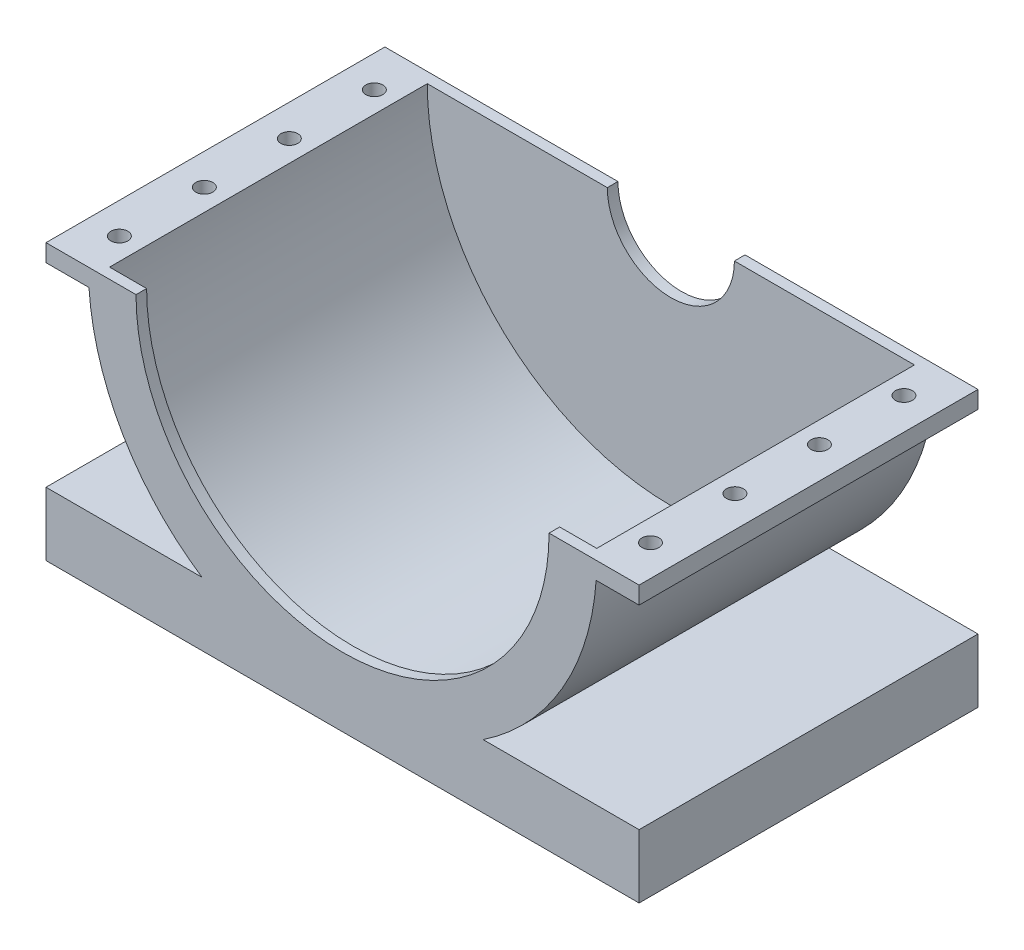
ISO-10303-21;
HEADER;
FILE_DESCRIPTION(('STEP AP214'),'2;1');
FILE_NAME('part.step','',(''),(''),'','','');
FILE_SCHEMA(('AUTOMOTIVE_DESIGN { 1 0 10303 214 1 1 1 1 }'));
ENDSEC;
DATA;
#1=APPLICATION_CONTEXT('core data for automotive mechanical design processes');
#2=APPLICATION_PROTOCOL_DEFINITION('international standard','automotive_design',2000,#1);
#3=PRODUCT_CONTEXT('',#1,'mechanical');
#4=PRODUCT('Part','Part','',(#3));
#5=PRODUCT_RELATED_PRODUCT_CATEGORY('part','',(#4));
#6=PRODUCT_DEFINITION_FORMATION('','',#4);
#7=PRODUCT_DEFINITION_CONTEXT('part definition',#1,'design');
#8=PRODUCT_DEFINITION('design','',#6,#7);
#9=PRODUCT_DEFINITION_SHAPE('','',#8);
#10=(LENGTH_UNIT() NAMED_UNIT(*) SI_UNIT(.MILLI.,.METRE.));
#11=(NAMED_UNIT(*) PLANE_ANGLE_UNIT() SI_UNIT($,.RADIAN.));
#12=(NAMED_UNIT(*) SI_UNIT($,.STERADIAN.) SOLID_ANGLE_UNIT());
#13=UNCERTAINTY_MEASURE_WITH_UNIT(LENGTH_MEASURE(1.E-05),#10,'distance_accuracy_value','');
#14=(GEOMETRIC_REPRESENTATION_CONTEXT(3) GLOBAL_UNCERTAINTY_ASSIGNED_CONTEXT((#13)) GLOBAL_UNIT_ASSIGNED_CONTEXT((#10,
#11,#12)) REPRESENTATION_CONTEXT('',''));
#15=CARTESIAN_POINT('',(0.,0.,0.));
#16=DIRECTION('',(0.,0.,1.));
#17=DIRECTION('',(1.,0.,0.));
#18=AXIS2_PLACEMENT_3D('',#15,#16,#17);
#19=CARTESIAN_POINT('',(0.,0.,-100.));
#20=DIRECTION('',(0.,0.,1.));
#21=DIRECTION('',(1.,0.,0.));
#22=AXIS2_PLACEMENT_3D('',#19,#20,#21);
#23=CYLINDRICAL_SURFACE('',#22,143.75);
#24=DIRECTION('',(0.,0.,1.));
#25=VECTOR('',#24,1.);
#26=CARTESIAN_POINT('',(143.75,0.,-100.));
#27=LINE('',#26,#25);
#28=CARTESIAN_POINT('',(143.75,0.,-93.75));
#29=VERTEX_POINT('',#28);
#30=CARTESIAN_POINT('',(143.75,0.,93.75));
#31=VERTEX_POINT('',#30);
#32=EDGE_CURVE('E55',#29,#31,#27,.T.);
#33=ORIENTED_EDGE('',*,*,#32,.F.);
#34=CARTESIAN_POINT('',(0.,0.,-93.75));
#35=DIRECTION('',(0.,0.,-1.));
#36=DIRECTION('',(-1.,0.,0.));
#37=AXIS2_PLACEMENT_3D('',#34,#35,#36);
#38=CIRCLE('',#37,143.75);
#39=CARTESIAN_POINT('',(-143.75,0.,-93.75));
#40=VERTEX_POINT('',#39);
#41=EDGE_CURVE('E50',#29,#40,#38,.T.);
#42=ORIENTED_EDGE('',*,*,#41,.T.);
#43=DIRECTION('',(0.,0.,1.));
#44=VECTOR('',#43,1.);
#45=CARTESIAN_POINT('',(-143.75,0.,-100.));
#46=LINE('',#45,#44);
#47=CARTESIAN_POINT('',(-143.75,0.,93.75));
#48=VERTEX_POINT('',#47);
#49=EDGE_CURVE('E300',#40,#48,#46,.T.);
#50=ORIENTED_EDGE('',*,*,#49,.T.);
#51=CARTESIAN_POINT('',(0.,0.,93.75));
#52=DIRECTION('',(0.,0.,1.));
#53=DIRECTION('',(1.,0.,0.));
#54=AXIS2_PLACEMENT_3D('',#51,#52,#53);
#55=CIRCLE('',#54,143.75);
#56=EDGE_CURVE('E197',#48,#31,#55,.T.);
#57=ORIENTED_EDGE('',*,*,#56,.T.);
#58=EDGE_LOOP('',(#33,#42,#50,#57));
#59=FACE_BOUND('',#58,.T.);
#60=ADVANCED_FACE('F33',(#59),#23,.F.);
#61=CARTESIAN_POINT('',(0.,0.,-100.));
#62=DIRECTION('',(0.,0.,1.));
#63=DIRECTION('',(1.,0.,0.));
#64=AXIS2_PLACEMENT_3D('',#61,#62,#63);
#65=CYLINDRICAL_SURFACE('',#64,150.);
#66=DIRECTION('',(0.,0.,1.));
#67=VECTOR('',#66,1.);
#68=CARTESIAN_POINT('',(149.649381889803,-10.2499999999999,-100.));
#69=LINE('',#68,#67);
#70=CARTESIAN_POINT('',(149.649381889803,-10.2499999999999,-100.));
#71=VERTEX_POINT('',#70);
#72=CARTESIAN_POINT('',(149.649381889803,-10.2499999999999,100.));
#73=VERTEX_POINT('',#72);
#74=EDGE_CURVE('E37',#71,#73,#69,.T.);
#75=ORIENTED_EDGE('',*,*,#74,.T.);
#76=CARTESIAN_POINT('',(0.,0.,100.));
#77=DIRECTION('',(0.,0.,1.));
#78=DIRECTION('',(1.,0.,0.));
#79=AXIS2_PLACEMENT_3D('',#76,#77,#78);
#80=CIRCLE('',#79,150.);
#81=CARTESIAN_POINT('',(82.915619758885,-125.,100.));
#82=VERTEX_POINT('',#81);
#83=EDGE_CURVE('E208',#82,#73,#80,.T.);
#84=ORIENTED_EDGE('',*,*,#83,.F.);
#85=DIRECTION('',(0.,0.,1.));
#86=VECTOR('',#85,1.);
#87=CARTESIAN_POINT('',(82.915619758885,-125.,-100.));
#88=LINE('',#87,#86);
#89=CARTESIAN_POINT('',(82.915619758885,-125.,-100.));
#90=VERTEX_POINT('',#89);
#91=EDGE_CURVE('E11',#90,#82,#88,.T.);
#92=ORIENTED_EDGE('',*,*,#91,.F.);
#93=CARTESIAN_POINT('',(0.,0.,-100.));
#94=DIRECTION('',(0.,0.,1.));
#95=DIRECTION('',(1.,0.,0.));
#96=AXIS2_PLACEMENT_3D('',#93,#94,#95);
#97=CIRCLE('',#96,150.);
#98=EDGE_CURVE('E248',#90,#71,#97,.T.);
#99=ORIENTED_EDGE('',*,*,#98,.T.);
#100=EDGE_LOOP('',(#75,#84,#92,#99));
#101=FACE_BOUND('',#100,.T.);
#102=ADVANCED_FACE('F35',(#101),#65,.T.);
#103=CARTESIAN_POINT('',(82.915619758885,-125.,-100.));
#104=DIRECTION('',(0.,1.,0.));
#105=DIRECTION('',(-1.,0.,0.));
#106=AXIS2_PLACEMENT_3D('',#103,#104,#105);
#107=PLANE('',#106);
#108=ORIENTED_EDGE('',*,*,#91,.T.);
#109=DIRECTION('',(-1.,0.,0.));
#110=VECTOR('',#109,1.);
#111=CARTESIAN_POINT('',(82.915619758885,-125.,100.));
#112=LINE('',#111,#110);
#113=CARTESIAN_POINT('',(175.,-125.,100.));
#114=VERTEX_POINT('',#113);
#115=EDGE_CURVE('E245',#114,#82,#112,.T.);
#116=ORIENTED_EDGE('',*,*,#115,.F.);
#117=DIRECTION('',(0.,0.,1.));
#118=VECTOR('',#117,1.);
#119=CARTESIAN_POINT('',(175.,-125.,-100.));
#120=LINE('',#119,#118);
#121=CARTESIAN_POINT('',(175.,-125.,-100.));
#122=VERTEX_POINT('',#121);
#123=EDGE_CURVE('E42',#122,#114,#120,.T.);
#124=ORIENTED_EDGE('',*,*,#123,.F.);
#125=DIRECTION('',(-1.,0.,0.));
#126=VECTOR('',#125,1.);
#127=CARTESIAN_POINT('',(82.915619758885,-125.,-100.));
#128=LINE('',#127,#126);
#129=EDGE_CURVE('E282',#122,#90,#128,.T.);
#130=ORIENTED_EDGE('',*,*,#129,.T.);
#131=EDGE_LOOP('',(#108,#116,#124,#130));
#132=FACE_BOUND('',#131,.T.);
#133=ADVANCED_FACE('F318',(#132),#107,.T.);
#134=CARTESIAN_POINT('',(175.,-125.,-100.));
#135=DIRECTION('',(1.,0.,0.));
#136=DIRECTION('',(0.,1.,0.));
#137=AXIS2_PLACEMENT_3D('',#134,#135,#136);
#138=PLANE('',#137);
#139=ORIENTED_EDGE('',*,*,#123,.T.);
#140=DIRECTION('',(0.,1.,0.));
#141=VECTOR('',#140,1.);
#142=CARTESIAN_POINT('',(175.,-125.,100.));
#143=LINE('',#142,#141);
#144=CARTESIAN_POINT('',(175.,-162.5,100.));
#145=VERTEX_POINT('',#144);
#146=EDGE_CURVE('E242',#145,#114,#143,.T.);
#147=ORIENTED_EDGE('',*,*,#146,.F.);
#148=DIRECTION('',(0.,0.,1.));
#149=VECTOR('',#148,1.);
#150=CARTESIAN_POINT('',(175.,-162.5,-100.));
#151=LINE('',#150,#149);
#152=CARTESIAN_POINT('',(175.,-162.5,-100.));
#153=VERTEX_POINT('',#152);
#154=EDGE_CURVE('E286',#153,#145,#151,.T.);
#155=ORIENTED_EDGE('',*,*,#154,.F.);
#156=DIRECTION('',(0.,1.,0.));
#157=VECTOR('',#156,1.);
#158=CARTESIAN_POINT('',(175.,-125.,-100.));
#159=LINE('',#158,#157);
#160=EDGE_CURVE('E279',#153,#122,#159,.T.);
#161=ORIENTED_EDGE('',*,*,#160,.T.);
#162=EDGE_LOOP('',(#139,#147,#155,#161));
#163=FACE_BOUND('',#162,.T.);
#164=ADVANCED_FACE('F358',(#163),#138,.T.);
#165=CARTESIAN_POINT('',(-175.,-162.5,-100.));
#166=DIRECTION('',(0.,-1.,0.));
#167=DIRECTION('',(1.,0.,0.));
#168=AXIS2_PLACEMENT_3D('',#165,#166,#167);
#169=PLANE('',#168);
#170=ORIENTED_EDGE('',*,*,#154,.T.);
#171=DIRECTION('',(1.,0.,0.));
#172=VECTOR('',#171,1.);
#173=CARTESIAN_POINT('',(-175.,-162.5,100.));
#174=LINE('',#173,#172);
#175=CARTESIAN_POINT('',(-175.,-162.5,100.));
#176=VERTEX_POINT('',#175);
#177=EDGE_CURVE('E239',#176,#145,#174,.T.);
#178=ORIENTED_EDGE('',*,*,#177,.F.);
#179=DIRECTION('',(0.,0.,1.));
#180=VECTOR('',#179,1.);
#181=CARTESIAN_POINT('',(-175.,-162.5,-100.));
#182=LINE('',#181,#180);
#183=CARTESIAN_POINT('',(-175.,-162.5,-100.));
#184=VERTEX_POINT('',#183);
#185=EDGE_CURVE('E288',#184,#176,#182,.T.);
#186=ORIENTED_EDGE('',*,*,#185,.F.);
#187=DIRECTION('',(1.,0.,0.));
#188=VECTOR('',#187,1.);
#189=CARTESIAN_POINT('',(-175.,-162.5,-100.));
#190=LINE('',#189,#188);
#191=EDGE_CURVE('E276',#184,#153,#190,.T.);
#192=ORIENTED_EDGE('',*,*,#191,.T.);
#193=EDGE_LOOP('',(#170,#178,#186,#192));
#194=FACE_BOUND('',#193,.T.);
#195=ADVANCED_FACE('F355',(#194),#169,.T.);
#196=CARTESIAN_POINT('',(-175.,-125.,-100.));
#197=DIRECTION('',(-1.,0.,0.));
#198=DIRECTION('',(0.,-1.,0.));
#199=AXIS2_PLACEMENT_3D('',#196,#197,#198);
#200=PLANE('',#199);
#201=ORIENTED_EDGE('',*,*,#185,.T.);
#202=DIRECTION('',(0.,-1.,0.));
#203=VECTOR('',#202,1.);
#204=CARTESIAN_POINT('',(-175.,-125.,100.));
#205=LINE('',#204,#203);
#206=CARTESIAN_POINT('',(-175.,-125.,100.));
#207=VERTEX_POINT('',#206);
#208=EDGE_CURVE('E236',#207,#176,#205,.T.);
#209=ORIENTED_EDGE('',*,*,#208,.F.);
#210=DIRECTION('',(0.,0.,1.));
#211=VECTOR('',#210,1.);
#212=CARTESIAN_POINT('',(-175.,-125.,-100.));
#213=LINE('',#212,#211);
#214=CARTESIAN_POINT('',(-175.,-125.,-100.));
#215=VERTEX_POINT('',#214);
#216=EDGE_CURVE('E290',#215,#207,#213,.T.);
#217=ORIENTED_EDGE('',*,*,#216,.F.);
#218=DIRECTION('',(0.,-1.,0.));
#219=VECTOR('',#218,1.);
#220=CARTESIAN_POINT('',(-175.,-125.,-100.));
#221=LINE('',#220,#219);
#222=EDGE_CURVE('E273',#215,#184,#221,.T.);
#223=ORIENTED_EDGE('',*,*,#222,.T.);
#224=EDGE_LOOP('',(#201,#209,#217,#223));
#225=FACE_BOUND('',#224,.T.);
#226=ADVANCED_FACE('F352',(#225),#200,.T.);
#227=CARTESIAN_POINT('',(-175.,-125.,-100.));
#228=DIRECTION('',(0.,1.,0.));
#229=DIRECTION('',(-1.,0.,0.));
#230=AXIS2_PLACEMENT_3D('',#227,#228,#229);
#231=PLANE('',#230);
#232=ORIENTED_EDGE('',*,*,#216,.T.);
#233=DIRECTION('',(-1.,0.,0.));
#234=VECTOR('',#233,1.);
#235=CARTESIAN_POINT('',(-175.,-125.,100.));
#236=LINE('',#235,#234);
#237=CARTESIAN_POINT('',(-82.915619758885,-125.,100.));
#238=VERTEX_POINT('',#237);
#239=EDGE_CURVE('E233',#238,#207,#236,.T.);
#240=ORIENTED_EDGE('',*,*,#239,.F.);
#241=DIRECTION('',(0.,0.,1.));
#242=VECTOR('',#241,1.);
#243=CARTESIAN_POINT('',(-82.915619758885,-125.,-100.));
#244=LINE('',#243,#242);
#245=CARTESIAN_POINT('',(-82.915619758885,-125.,-100.));
#246=VERTEX_POINT('',#245);
#247=EDGE_CURVE('E292',#246,#238,#244,.T.);
#248=ORIENTED_EDGE('',*,*,#247,.F.);
#249=DIRECTION('',(-1.,0.,0.));
#250=VECTOR('',#249,1.);
#251=CARTESIAN_POINT('',(-175.,-125.,-100.));
#252=LINE('',#251,#250);
#253=EDGE_CURVE('E270',#246,#215,#252,.T.);
#254=ORIENTED_EDGE('',*,*,#253,.T.);
#255=EDGE_LOOP('',(#232,#240,#248,#254));
#256=FACE_BOUND('',#255,.T.);
#257=ADVANCED_FACE('F350',(#256),#231,.T.);
#258=CARTESIAN_POINT('',(0.,0.,-100.));
#259=DIRECTION('',(0.,0.,1.));
#260=DIRECTION('',(1.,0.,0.));
#261=AXIS2_PLACEMENT_3D('',#258,#259,#260);
#262=CYLINDRICAL_SURFACE('',#261,150.);
#263=ORIENTED_EDGE('',*,*,#247,.T.);
#264=CARTESIAN_POINT('',(0.,0.,100.));
#265=DIRECTION('',(0.,0.,1.));
#266=DIRECTION('',(1.,0.,0.));
#267=AXIS2_PLACEMENT_3D('',#264,#265,#266);
#268=CIRCLE('',#267,150.);
#269=CARTESIAN_POINT('',(-149.649381889803,-10.2499999999999,100.));
#270=VERTEX_POINT('',#269);
#271=EDGE_CURVE('E230',#270,#238,#268,.T.);
#272=ORIENTED_EDGE('',*,*,#271,.F.);
#273=DIRECTION('',(0.,0.,1.));
#274=VECTOR('',#273,1.);
#275=CARTESIAN_POINT('',(-149.649381889803,-10.2499999999999,-100.));
#276=LINE('',#275,#274);
#277=CARTESIAN_POINT('',(-149.649381889803,-10.2499999999999,-100.));
#278=VERTEX_POINT('',#277);
#279=EDGE_CURVE('E294',#278,#270,#276,.T.);
#280=ORIENTED_EDGE('',*,*,#279,.F.);
#281=CARTESIAN_POINT('',(0.,0.,-100.));
#282=DIRECTION('',(0.,0.,1.));
#283=DIRECTION('',(1.,0.,0.));
#284=AXIS2_PLACEMENT_3D('',#281,#282,#283);
#285=CIRCLE('',#284,150.);
#286=EDGE_CURVE('E267',#278,#246,#285,.T.);
#287=ORIENTED_EDGE('',*,*,#286,.T.);
#288=EDGE_LOOP('',(#263,#272,#280,#287));
#289=FACE_BOUND('',#288,.T.);
#290=ADVANCED_FACE('F345',(#289),#262,.T.);
#291=CARTESIAN_POINT('',(-175.,-10.25,-100.));
#292=DIRECTION('',(0.,-1.,0.));
#293=DIRECTION('',(1.,0.,0.));
#294=AXIS2_PLACEMENT_3D('',#291,#292,#293);
#295=PLANE('',#294);
#296=CARTESIAN_POINT('',(-156.711909332652,-10.25,74.999288797542));
#297=DIRECTION('',(0.,-1.,0.));
#298=DIRECTION('',(1.,0.,0.));
#299=AXIS2_PLACEMENT_3D('',#296,#297,#298);
#300=CIRCLE('',#299,4.99999999999999);
#301=CARTESIAN_POINT('',(-151.711909332652,-10.25,74.999288797542));
#302=VERTEX_POINT('',#301);
#303=EDGE_CURVE('E423',#302,#302,#300,.F.);
#304=ORIENTED_EDGE('',*,*,#303,.T.);
#305=EDGE_LOOP('',(#304));
#306=FACE_BOUND('',#305,.T.);
#307=CARTESIAN_POINT('',(-156.557939555101,-10.25,24.999525865028));
#308=DIRECTION('',(0.,-1.,0.));
#309=DIRECTION('',(1.,0.,0.));
#310=AXIS2_PLACEMENT_3D('',#307,#308,#309);
#311=CIRCLE('',#310,4.99999999999999);
#312=CARTESIAN_POINT('',(-151.557939555101,-10.25,24.999525865028));
#313=VERTEX_POINT('',#312);
#314=EDGE_CURVE('E429',#313,#313,#311,.F.);
#315=ORIENTED_EDGE('',*,*,#314,.T.);
#316=EDGE_LOOP('',(#315));
#317=FACE_BOUND('',#316,.T.);
#318=CARTESIAN_POINT('',(-156.403969777551,-10.25,-25.000237067486));
#319=DIRECTION('',(0.,-1.,0.));
#320=DIRECTION('',(1.,0.,0.));
#321=AXIS2_PLACEMENT_3D('',#318,#319,#320);
#322=CIRCLE('',#321,4.99999999999999);
#323=CARTESIAN_POINT('',(-151.403969777551,-10.25,-25.000237067486));
#324=VERTEX_POINT('',#323);
#325=EDGE_CURVE('E439',#324,#324,#322,.F.);
#326=ORIENTED_EDGE('',*,*,#325,.T.);
#327=EDGE_LOOP('',(#326));
#328=FACE_BOUND('',#327,.T.);
#329=CARTESIAN_POINT('',(-156.25,-10.25,-75.));
#330=DIRECTION('',(0.,-1.,0.));
#331=DIRECTION('',(1.,0.,0.));
#332=AXIS2_PLACEMENT_3D('',#329,#330,#331);
#333=CIRCLE('',#332,4.99999999999999);
#334=CARTESIAN_POINT('',(-151.25,-10.25,-75.));
#335=VERTEX_POINT('',#334);
#336=EDGE_CURVE('E410',#335,#335,#333,.F.);
#337=ORIENTED_EDGE('',*,*,#336,.T.);
#338=EDGE_LOOP('',(#337));
#339=FACE_BOUND('',#338,.T.);
#340=ORIENTED_EDGE('',*,*,#279,.T.);
#341=DIRECTION('',(1.,0.,0.));
#342=VECTOR('',#341,1.);
#343=CARTESIAN_POINT('',(-175.,-10.25,100.));
#344=LINE('',#343,#342);
#345=CARTESIAN_POINT('',(-175.,-10.25,100.));
#346=VERTEX_POINT('',#345);
#347=EDGE_CURVE('E227',#346,#270,#344,.T.);
#348=ORIENTED_EDGE('',*,*,#347,.F.);
#349=DIRECTION('',(0.,0.,1.));
#350=VECTOR('',#349,1.);
#351=CARTESIAN_POINT('',(-175.,-10.25,-100.));
#352=LINE('',#351,#350);
#353=CARTESIAN_POINT('',(-175.,-10.25,-100.));
#354=VERTEX_POINT('',#353);
#355=EDGE_CURVE('E296',#354,#346,#352,.T.);
#356=ORIENTED_EDGE('',*,*,#355,.F.);
#357=DIRECTION('',(1.,0.,0.));
#358=VECTOR('',#357,1.);
#359=CARTESIAN_POINT('',(-175.,-10.25,-100.));
#360=LINE('',#359,#358);
#361=EDGE_CURVE('E264',#354,#278,#360,.T.);
#362=ORIENTED_EDGE('',*,*,#361,.T.);
#363=EDGE_LOOP('',(#340,#348,#356,#362));
#364=FACE_BOUND('',#363,.T.);
#365=ADVANCED_FACE('F340',(#306,#317,#328,#339,#364),#295,.T.);
#366=CARTESIAN_POINT('',(-175.,0.,-100.));
#367=DIRECTION('',(-1.,0.,0.));
#368=DIRECTION('',(0.,0.,1.));
#369=AXIS2_PLACEMENT_3D('',#366,#367,#368);
#370=PLANE('',#369);
#371=ORIENTED_EDGE('',*,*,#355,.T.);
#372=DIRECTION('',(0.,-1.,0.));
#373=VECTOR('',#372,1.);
#374=CARTESIAN_POINT('',(-175.,0.,100.));
#375=LINE('',#374,#373);
#376=CARTESIAN_POINT('',(-175.,0.,100.));
#377=VERTEX_POINT('',#376);
#378=EDGE_CURVE('E224',#377,#346,#375,.T.);
#379=ORIENTED_EDGE('',*,*,#378,.F.);
#380=DIRECTION('',(0.,0.,1.));
#381=VECTOR('',#380,1.);
#382=CARTESIAN_POINT('',(-175.,0.,-100.));
#383=LINE('',#382,#381);
#384=CARTESIAN_POINT('',(-175.,0.,-100.));
#385=VERTEX_POINT('',#384);
#386=EDGE_CURVE('E298',#385,#377,#383,.T.);
#387=ORIENTED_EDGE('',*,*,#386,.F.);
#388=DIRECTION('',(0.,-1.,0.));
#389=VECTOR('',#388,1.);
#390=CARTESIAN_POINT('',(-175.,0.,-100.));
#391=LINE('',#390,#389);
#392=EDGE_CURVE('E261',#385,#354,#391,.T.);
#393=ORIENTED_EDGE('',*,*,#392,.T.);
#394=EDGE_LOOP('',(#371,#379,#387,#393));
#395=FACE_BOUND('',#394,.T.);
#396=ADVANCED_FACE('F336',(#395),#370,.T.);
#397=CARTESIAN_POINT('',(-175.,0.,-100.));
#398=DIRECTION('',(0.,1.,0.));
#399=DIRECTION('',(-1.,0.,0.));
#400=AXIS2_PLACEMENT_3D('',#397,#398,#399);
#401=PLANE('',#400);
#402=CARTESIAN_POINT('',(-156.711909332652,0.,74.999288797542));
#403=DIRECTION('',(0.,1.,0.));
#404=DIRECTION('',(1.,0.,0.));
#405=AXIS2_PLACEMENT_3D('',#402,#403,#404);
#406=CIRCLE('',#405,4.99999999999999);
#407=CARTESIAN_POINT('',(-151.711909332652,0.,74.999288797542));
#408=VERTEX_POINT('',#407);
#409=EDGE_CURVE('E420',#408,#408,#406,.T.);
#410=ORIENTED_EDGE('',*,*,#409,.F.);
#411=EDGE_LOOP('',(#410));
#412=FACE_BOUND('',#411,.T.);
#413=CARTESIAN_POINT('',(-156.557939555101,0.,24.999525865028));
#414=DIRECTION('',(0.,1.,0.));
#415=DIRECTION('',(1.,0.,0.));
#416=AXIS2_PLACEMENT_3D('',#413,#414,#415);
#417=CIRCLE('',#416,4.99999999999999);
#418=CARTESIAN_POINT('',(-151.557939555101,0.,24.999525865028));
#419=VERTEX_POINT('',#418);
#420=EDGE_CURVE('E425',#419,#419,#417,.T.);
#421=ORIENTED_EDGE('',*,*,#420,.F.);
#422=EDGE_LOOP('',(#421));
#423=FACE_BOUND('',#422,.T.);
#424=CARTESIAN_POINT('',(-156.403969777551,0.,-25.000237067486));
#425=DIRECTION('',(0.,1.,0.));
#426=DIRECTION('',(1.,0.,0.));
#427=AXIS2_PLACEMENT_3D('',#424,#425,#426);
#428=CIRCLE('',#427,4.99999999999999);
#429=CARTESIAN_POINT('',(-151.403969777551,0.,-25.000237067486));
#430=VERTEX_POINT('',#429);
#431=EDGE_CURVE('E434',#430,#430,#428,.T.);
#432=ORIENTED_EDGE('',*,*,#431,.F.);
#433=EDGE_LOOP('',(#432));
#434=FACE_BOUND('',#433,.T.);
#435=CARTESIAN_POINT('',(-156.25,0.,-75.));
#436=DIRECTION('',(0.,1.,0.));
#437=DIRECTION('',(1.,0.,0.));
#438=AXIS2_PLACEMENT_3D('',#435,#436,#437);
#439=CIRCLE('',#438,4.99999999999999);
#440=CARTESIAN_POINT('',(-151.25,0.,-75.));
#441=VERTEX_POINT('',#440);
#442=EDGE_CURVE('E441',#441,#441,#439,.T.);
#443=ORIENTED_EDGE('',*,*,#442,.F.);
#444=EDGE_LOOP('',(#443));
#445=FACE_BOUND('',#444,.T.);
#446=ORIENTED_EDGE('',*,*,#386,.T.);
#447=DIRECTION('',(-1.,0.,0.));
#448=VECTOR('',#447,1.);
#449=CARTESIAN_POINT('',(-175.,0.,100.));
#450=LINE('',#449,#448);
#451=CARTESIAN_POINT('',(-121.875,0.,100.));
#452=VERTEX_POINT('',#451);
#453=EDGE_CURVE('E221',#452,#377,#450,.T.);
#454=ORIENTED_EDGE('',*,*,#453,.F.);
#455=DIRECTION('',(0.,0.,1.));
#456=VECTOR('',#455,1.);
#457=CARTESIAN_POINT('',(-121.875,0.,93.75));
#458=LINE('',#457,#456);
#459=CARTESIAN_POINT('',(-121.875,0.,93.75));
#460=VERTEX_POINT('',#459);
#461=EDGE_CURVE('E202',#460,#452,#458,.T.);
#462=ORIENTED_EDGE('',*,*,#461,.F.);
#463=DIRECTION('',(-1.,0.,0.));
#464=VECTOR('',#463,1.);
#465=CARTESIAN_POINT('',(-143.75,0.,93.75));
#466=LINE('',#465,#464);
#467=EDGE_CURVE('E194',#460,#48,#466,.T.);
#468=ORIENTED_EDGE('',*,*,#467,.T.);
#469=ORIENTED_EDGE('',*,*,#49,.F.);
#470=DIRECTION('',(1.,0.,0.));
#471=VECTOR('',#470,1.);
#472=CARTESIAN_POINT('',(-37.5,0.,-93.75));
#473=LINE('',#472,#471);
#474=CARTESIAN_POINT('',(-37.5,0.,-93.75));
#475=VERTEX_POINT('',#474);
#476=EDGE_CURVE('E168',#40,#475,#473,.T.);
#477=ORIENTED_EDGE('',*,*,#476,.T.);
#478=DIRECTION('',(0.,0.,-1.));
#479=VECTOR('',#478,1.);
#480=CARTESIAN_POINT('',(-37.5,0.,-93.75));
#481=LINE('',#480,#479);
#482=CARTESIAN_POINT('',(-37.5,0.,-100.));
#483=VERTEX_POINT('',#482);
#484=EDGE_CURVE('E167',#475,#483,#481,.T.);
#485=ORIENTED_EDGE('',*,*,#484,.T.);
#486=DIRECTION('',(-1.,0.,0.));
#487=VECTOR('',#486,1.);
#488=CARTESIAN_POINT('',(-175.,0.,-100.));
#489=LINE('',#488,#487);
#490=EDGE_CURVE('E258',#483,#385,#489,.T.);
#491=ORIENTED_EDGE('',*,*,#490,.T.);
#492=EDGE_LOOP('',(#446,#454,#462,#468,#469,#477,#485,#491));
#493=FACE_BOUND('',#492,.T.);
#494=ADVANCED_FACE('F374',(#412,#423,#434,#445,#493),#401,.T.);
#495=CARTESIAN_POINT('',(143.75,0.,-100.));
#496=DIRECTION('',(0.,1.,0.));
#497=DIRECTION('',(-1.,0.,0.));
#498=AXIS2_PLACEMENT_3D('',#495,#496,#497);
#499=PLANE('',#498);
#500=CARTESIAN_POINT('',(156.403969777551,0.,-25.000237067486));
#501=DIRECTION('',(0.,1.,0.));
#502=DIRECTION('',(-1.,0.,0.));
#503=AXIS2_PLACEMENT_3D('',#500,#501,#502);
#504=CIRCLE('',#503,4.99999999999999);
#505=CARTESIAN_POINT('',(151.403969777551,0.,-25.000237067486));
#506=VERTEX_POINT('',#505);
#507=EDGE_CURVE('E401',#506,#506,#504,.T.);
#508=ORIENTED_EDGE('',*,*,#507,.F.);
#509=EDGE_LOOP('',(#508));
#510=FACE_BOUND('',#509,.T.);
#511=CARTESIAN_POINT('',(156.557939555101,0.,24.999525865028));
#512=DIRECTION('',(0.,1.,0.));
#513=DIRECTION('',(-1.,0.,0.));
#514=AXIS2_PLACEMENT_3D('',#511,#512,#513);
#515=CIRCLE('',#514,4.99999999999999);
#516=CARTESIAN_POINT('',(151.557939555101,0.,24.999525865028));
#517=VERTEX_POINT('',#516);
#518=EDGE_CURVE('E407',#517,#517,#515,.T.);
#519=ORIENTED_EDGE('',*,*,#518,.F.);
#520=EDGE_LOOP('',(#519));
#521=FACE_BOUND('',#520,.T.);
#522=CARTESIAN_POINT('',(156.711909332652,0.,74.999288797542));
#523=DIRECTION('',(0.,1.,0.));
#524=DIRECTION('',(-1.,0.,0.));
#525=AXIS2_PLACEMENT_3D('',#522,#523,#524);
#526=CIRCLE('',#525,4.99999999999999);
#527=CARTESIAN_POINT('',(151.711909332652,0.,74.999288797542));
#528=VERTEX_POINT('',#527);
#529=EDGE_CURVE('E416',#528,#528,#526,.T.);
#530=ORIENTED_EDGE('',*,*,#529,.F.);
#531=EDGE_LOOP('',(#530));
#532=FACE_BOUND('',#531,.T.);
#533=CARTESIAN_POINT('',(156.25,0.,-75.));
#534=DIRECTION('',(0.,1.,0.));
#535=DIRECTION('',(-1.,0.,0.));
#536=AXIS2_PLACEMENT_3D('',#533,#534,#535);
#537=CIRCLE('',#536,4.99999999999999);
#538=CARTESIAN_POINT('',(151.25,0.,-75.));
#539=VERTEX_POINT('',#538);
#540=EDGE_CURVE('E181',#539,#539,#537,.T.);
#541=ORIENTED_EDGE('',*,*,#540,.F.);
#542=EDGE_LOOP('',(#541));
#543=FACE_BOUND('',#542,.T.);
#544=DIRECTION('',(-1.,0.,0.));
#545=VECTOR('',#544,1.);
#546=CARTESIAN_POINT('',(143.75,0.,-100.));
#547=LINE('',#546,#545);
#548=CARTESIAN_POINT('',(175.,0.,-100.));
#549=VERTEX_POINT('',#548);
#550=CARTESIAN_POINT('',(37.5,0.,-100.));
#551=VERTEX_POINT('',#550);
#552=EDGE_CURVE('E162',#549,#551,#547,.T.);
#553=ORIENTED_EDGE('',*,*,#552,.T.);
#554=DIRECTION('',(0.,0.,-1.));
#555=VECTOR('',#554,1.);
#556=CARTESIAN_POINT('',(37.5,0.,-93.75));
#557=LINE('',#556,#555);
#558=CARTESIAN_POINT('',(37.5,0.,-93.75));
#559=VERTEX_POINT('',#558);
#560=EDGE_CURVE('E157',#559,#551,#557,.T.);
#561=ORIENTED_EDGE('',*,*,#560,.F.);
#562=DIRECTION('',(1.,0.,0.));
#563=VECTOR('',#562,1.);
#564=CARTESIAN_POINT('',(143.75,0.,-93.75));
#565=LINE('',#564,#563);
#566=EDGE_CURVE('E160',#559,#29,#565,.T.);
#567=ORIENTED_EDGE('',*,*,#566,.T.);
#568=ORIENTED_EDGE('',*,*,#32,.T.);
#569=DIRECTION('',(-1.,0.,0.));
#570=VECTOR('',#569,1.);
#571=CARTESIAN_POINT('',(121.875,0.,93.75));
#572=LINE('',#571,#570);
#573=CARTESIAN_POINT('',(121.875,0.,93.75));
#574=VERTEX_POINT('',#573);
#575=EDGE_CURVE('E199',#31,#574,#572,.T.);
#576=ORIENTED_EDGE('',*,*,#575,.T.);
#577=DIRECTION('',(0.,0.,1.));
#578=VECTOR('',#577,1.);
#579=CARTESIAN_POINT('',(121.875,0.,93.75));
#580=LINE('',#579,#578);
#581=CARTESIAN_POINT('',(121.875,0.,100.));
#582=VERTEX_POINT('',#581);
#583=EDGE_CURVE('E205',#574,#582,#580,.T.);
#584=ORIENTED_EDGE('',*,*,#583,.T.);
#585=DIRECTION('',(-1.,0.,0.));
#586=VECTOR('',#585,1.);
#587=CARTESIAN_POINT('',(143.75,0.,100.));
#588=LINE('',#587,#586);
#589=CARTESIAN_POINT('',(175.,0.,100.));
#590=VERTEX_POINT('',#589);
#591=EDGE_CURVE('E219',#590,#582,#588,.T.);
#592=ORIENTED_EDGE('',*,*,#591,.F.);
#593=DIRECTION('',(0.,0.,1.));
#594=VECTOR('',#593,1.);
#595=CARTESIAN_POINT('',(175.,0.,-100.));
#596=LINE('',#595,#594);
#597=EDGE_CURVE('E303',#549,#590,#596,.T.);
#598=ORIENTED_EDGE('',*,*,#597,.F.);
#599=EDGE_LOOP('',(#553,#561,#567,#568,#576,#584,#592,#598));
#600=FACE_BOUND('',#599,.T.);
#601=ADVANCED_FACE('F159',(#510,#521,#532,#543,#600),#499,.T.);
#602=CARTESIAN_POINT('',(175.,-10.2499999999999,-100.));
#603=DIRECTION('',(1.,0.,0.));
#604=DIRECTION('',(0.,0.,-1.));
#605=AXIS2_PLACEMENT_3D('',#602,#603,#604);
#606=PLANE('',#605);
#607=ORIENTED_EDGE('',*,*,#597,.T.);
#608=DIRECTION('',(0.,1.,0.));
#609=VECTOR('',#608,1.);
#610=CARTESIAN_POINT('',(175.,-10.2499999999999,100.));
#611=LINE('',#610,#609);
#612=CARTESIAN_POINT('',(175.,-10.2499999999999,100.));
#613=VERTEX_POINT('',#612);
#614=EDGE_CURVE('E216',#613,#590,#611,.T.);
#615=ORIENTED_EDGE('',*,*,#614,.F.);
#616=DIRECTION('',(0.,0.,1.));
#617=VECTOR('',#616,1.);
#618=CARTESIAN_POINT('',(175.,-10.2499999999999,-100.));
#619=LINE('',#618,#617);
#620=CARTESIAN_POINT('',(175.,-10.2499999999999,-100.));
#621=VERTEX_POINT('',#620);
#622=EDGE_CURVE('E304',#621,#613,#619,.T.);
#623=ORIENTED_EDGE('',*,*,#622,.F.);
#624=DIRECTION('',(0.,1.,0.));
#625=VECTOR('',#624,1.);
#626=CARTESIAN_POINT('',(175.,-10.2499999999999,-100.));
#627=LINE('',#626,#625);
#628=EDGE_CURVE('E254',#621,#549,#627,.T.);
#629=ORIENTED_EDGE('',*,*,#628,.T.);
#630=EDGE_LOOP('',(#607,#615,#623,#629));
#631=FACE_BOUND('',#630,.T.);
#632=ADVANCED_FACE('F325',(#631),#606,.T.);
#633=CARTESIAN_POINT('',(149.649381889803,-10.2499999999999,-100.));
#634=DIRECTION('',(0.,-1.,0.));
#635=DIRECTION('',(0.,0.,-1.));
#636=AXIS2_PLACEMENT_3D('',#633,#634,#635);
#637=PLANE('',#636);
#638=CARTESIAN_POINT('',(156.403969777551,-10.2499999999999,-25.000237067486));
#639=DIRECTION('',(0.,-1.,0.));
#640=DIRECTION('',(0.,0.,-1.));
#641=AXIS2_PLACEMENT_3D('',#638,#639,#640);
#642=CIRCLE('',#641,4.99999999999999);
#643=CARTESIAN_POINT('',(156.403969777551,-10.2499999999999,-30.000237067486));
#644=VERTEX_POINT('',#643);
#645=EDGE_CURVE('E389',#644,#644,#642,.F.);
#646=ORIENTED_EDGE('',*,*,#645,.T.);
#647=EDGE_LOOP('',(#646));
#648=FACE_BOUND('',#647,.T.);
#649=CARTESIAN_POINT('',(156.557939555101,-10.2499999999999,24.999525865028));
#650=DIRECTION('',(0.,-1.,0.));
#651=DIRECTION('',(0.,0.,-1.));
#652=AXIS2_PLACEMENT_3D('',#649,#650,#651);
#653=CIRCLE('',#652,4.99999999999999);
#654=CARTESIAN_POINT('',(156.557939555101,-10.2499999999999,19.999525865028));
#655=VERTEX_POINT('',#654);
#656=EDGE_CURVE('E393',#655,#655,#653,.F.);
#657=ORIENTED_EDGE('',*,*,#656,.T.);
#658=EDGE_LOOP('',(#657));
#659=FACE_BOUND('',#658,.T.);
#660=CARTESIAN_POINT('',(156.711909332652,-10.2499999999999,74.999288797542));
#661=DIRECTION('',(0.,-1.,0.));
#662=DIRECTION('',(0.,0.,-1.));
#663=AXIS2_PLACEMENT_3D('',#660,#661,#662);
#664=CIRCLE('',#663,4.99999999999999);
#665=CARTESIAN_POINT('',(156.711909332652,-10.2499999999999,69.999288797542));
#666=VERTEX_POINT('',#665);
#667=EDGE_CURVE('E397',#666,#666,#664,.F.);
#668=ORIENTED_EDGE('',*,*,#667,.T.);
#669=EDGE_LOOP('',(#668));
#670=FACE_BOUND('',#669,.T.);
#671=CARTESIAN_POINT('',(156.25,-10.2499999999999,-75.));
#672=DIRECTION('',(0.,-1.,0.));
#673=DIRECTION('',(0.,0.,-1.));
#674=AXIS2_PLACEMENT_3D('',#671,#672,#673);
#675=CIRCLE('',#674,4.99999999999999);
#676=CARTESIAN_POINT('',(156.25,-10.2499999999999,-80.));
#677=VERTEX_POINT('',#676);
#678=EDGE_CURVE('E184',#677,#677,#675,.F.);
#679=ORIENTED_EDGE('',*,*,#678,.T.);
#680=EDGE_LOOP('',(#679));
#681=FACE_BOUND('',#680,.T.);
#682=ORIENTED_EDGE('',*,*,#622,.T.);
#683=DIRECTION('',(1.,0.,0.));
#684=VECTOR('',#683,1.);
#685=CARTESIAN_POINT('',(149.649381889803,-10.2499999999999,100.));
#686=LINE('',#685,#684);
#687=EDGE_CURVE('E213',#73,#613,#686,.T.);
#688=ORIENTED_EDGE('',*,*,#687,.F.);
#689=ORIENTED_EDGE('',*,*,#74,.F.);
#690=DIRECTION('',(1.,0.,0.));
#691=VECTOR('',#690,1.);
#692=CARTESIAN_POINT('',(149.649381889803,-10.2499999999999,-100.));
#693=LINE('',#692,#691);
#694=EDGE_CURVE('E251',#71,#621,#693,.T.);
#695=ORIENTED_EDGE('',*,*,#694,.T.);
#696=EDGE_LOOP('',(#682,#688,#689,#695));
#697=FACE_BOUND('',#696,.T.);
#698=ADVANCED_FACE('F311',(#648,#659,#670,#681,#697),#637,.T.);
#699=CARTESIAN_POINT('',(0.,0.,-100.));
#700=DIRECTION('',(0.,0.,1.));
#701=DIRECTION('',(1.,0.,0.));
#702=AXIS2_PLACEMENT_3D('',#699,#700,#701);
#703=PLANE('',#702);
#704=ORIENTED_EDGE('',*,*,#98,.F.);
#705=ORIENTED_EDGE('',*,*,#129,.F.);
#706=ORIENTED_EDGE('',*,*,#160,.F.);
#707=ORIENTED_EDGE('',*,*,#191,.F.);
#708=ORIENTED_EDGE('',*,*,#222,.F.);
#709=ORIENTED_EDGE('',*,*,#253,.F.);
#710=ORIENTED_EDGE('',*,*,#286,.F.);
#711=ORIENTED_EDGE('',*,*,#361,.F.);
#712=ORIENTED_EDGE('',*,*,#392,.F.);
#713=ORIENTED_EDGE('',*,*,#490,.F.);
#714=CARTESIAN_POINT('',(0.,0.,-100.));
#715=DIRECTION('',(0.,0.,1.));
#716=DIRECTION('',(-1.,0.,0.));
#717=AXIS2_PLACEMENT_3D('',#714,#715,#716);
#718=CIRCLE('',#717,37.5);
#719=EDGE_CURVE('E179',#483,#551,#718,.T.);
#720=ORIENTED_EDGE('',*,*,#719,.T.);
#721=ORIENTED_EDGE('',*,*,#552,.F.);
#722=ORIENTED_EDGE('',*,*,#628,.F.);
#723=ORIENTED_EDGE('',*,*,#694,.F.);
#724=EDGE_LOOP('',(#704,#705,#706,#707,#708,#709,#710,#711,#712,#713,#720,#721,#722,#723));
#725=FACE_BOUND('',#724,.T.);
#726=ADVANCED_FACE('F321',(#725),#703,.F.);
#727=CARTESIAN_POINT('',(0.,0.,100.));
#728=DIRECTION('',(0.,0.,1.));
#729=DIRECTION('',(1.,0.,0.));
#730=AXIS2_PLACEMENT_3D('',#727,#728,#729);
#731=PLANE('',#730);
#732=ORIENTED_EDGE('',*,*,#83,.T.);
#733=ORIENTED_EDGE('',*,*,#687,.T.);
#734=ORIENTED_EDGE('',*,*,#614,.T.);
#735=ORIENTED_EDGE('',*,*,#591,.T.);
#736=CARTESIAN_POINT('',(0.,0.,100.));
#737=DIRECTION('',(0.,0.,-1.));
#738=DIRECTION('',(1.,0.,0.));
#739=AXIS2_PLACEMENT_3D('',#736,#737,#738);
#740=CIRCLE('',#739,121.875);
#741=EDGE_CURVE('E189',#582,#452,#740,.T.);
#742=ORIENTED_EDGE('',*,*,#741,.T.);
#743=ORIENTED_EDGE('',*,*,#453,.T.);
#744=ORIENTED_EDGE('',*,*,#378,.T.);
#745=ORIENTED_EDGE('',*,*,#347,.T.);
#746=ORIENTED_EDGE('',*,*,#271,.T.);
#747=ORIENTED_EDGE('',*,*,#239,.T.);
#748=ORIENTED_EDGE('',*,*,#208,.T.);
#749=ORIENTED_EDGE('',*,*,#177,.T.);
#750=ORIENTED_EDGE('',*,*,#146,.T.);
#751=ORIENTED_EDGE('',*,*,#115,.T.);
#752=EDGE_LOOP('',(#732,#733,#734,#735,#742,#743,#744,#745,#746,#747,#748,#749,#750,#751));
#753=FACE_BOUND('',#752,.T.);
#754=ADVANCED_FACE('F314',(#753),#731,.T.);
#755=CARTESIAN_POINT('',(0.,0.,93.75));
#756=DIRECTION('',(0.,0.,1.));
#757=DIRECTION('',(1.,0.,0.));
#758=AXIS2_PLACEMENT_3D('',#755,#756,#757);
#759=CYLINDRICAL_SURFACE('',#758,121.875);
#760=ORIENTED_EDGE('',*,*,#741,.F.);
#761=ORIENTED_EDGE('',*,*,#583,.F.);
#762=CARTESIAN_POINT('',(0.,0.,93.75));
#763=DIRECTION('',(0.,0.,-1.));
#764=DIRECTION('',(1.,0.,0.));
#765=AXIS2_PLACEMENT_3D('',#762,#763,#764);
#766=CIRCLE('',#765,121.875);
#767=EDGE_CURVE('E191',#574,#460,#766,.T.);
#768=ORIENTED_EDGE('',*,*,#767,.T.);
#769=ORIENTED_EDGE('',*,*,#461,.T.);
#770=EDGE_LOOP('',(#760,#761,#768,#769));
#771=FACE_BOUND('',#770,.T.);
#772=ADVANCED_FACE('F331',(#771),#759,.F.);
#773=CARTESIAN_POINT('',(0.,0.,93.75));
#774=DIRECTION('',(0.,0.,1.));
#775=DIRECTION('',(1.,0.,0.));
#776=AXIS2_PLACEMENT_3D('',#773,#774,#775);
#777=PLANE('',#776);
#778=ORIENTED_EDGE('',*,*,#767,.F.);
#779=ORIENTED_EDGE('',*,*,#575,.F.);
#780=ORIENTED_EDGE('',*,*,#56,.F.);
#781=ORIENTED_EDGE('',*,*,#467,.F.);
#782=EDGE_LOOP('',(#778,#779,#780,#781));
#783=FACE_BOUND('',#782,.T.);
#784=ADVANCED_FACE('F484',(#783),#777,.F.);
#785=CARTESIAN_POINT('',(0.,0.,-93.75));
#786=DIRECTION('',(0.,0.,-1.));
#787=DIRECTION('',(-1.,0.,0.));
#788=AXIS2_PLACEMENT_3D('',#785,#786,#787);
#789=CYLINDRICAL_SURFACE('',#788,37.5);
#790=ORIENTED_EDGE('',*,*,#719,.F.);
#791=ORIENTED_EDGE('',*,*,#484,.F.);
#792=CARTESIAN_POINT('',(0.,0.,-93.75));
#793=DIRECTION('',(0.,0.,1.));
#794=DIRECTION('',(-1.,0.,0.));
#795=AXIS2_PLACEMENT_3D('',#792,#793,#794);
#796=CIRCLE('',#795,37.5);
#797=EDGE_CURVE('E174',#475,#559,#796,.T.);
#798=ORIENTED_EDGE('',*,*,#797,.T.);
#799=ORIENTED_EDGE('',*,*,#560,.T.);
#800=EDGE_LOOP('',(#790,#791,#798,#799));
#801=FACE_BOUND('',#800,.T.);
#802=ADVANCED_FACE('F177',(#801),#789,.F.);
#803=CARTESIAN_POINT('',(0.,0.,-93.75));
#804=DIRECTION('',(0.,0.,-1.));
#805=DIRECTION('',(-1.,0.,0.));
#806=AXIS2_PLACEMENT_3D('',#803,#804,#805);
#807=PLANE('',#806);
#808=ORIENTED_EDGE('',*,*,#797,.F.);
#809=ORIENTED_EDGE('',*,*,#476,.F.);
#810=ORIENTED_EDGE('',*,*,#41,.F.);
#811=ORIENTED_EDGE('',*,*,#566,.F.);
#812=EDGE_LOOP('',(#808,#809,#810,#811));
#813=FACE_BOUND('',#812,.T.);
#814=ADVANCED_FACE('F172',(#813),#807,.F.);
#815=CARTESIAN_POINT('',(156.25,-162.501,-75.));
#816=DIRECTION('',(0.,1.,0.));
#817=DIRECTION('',(-1.,0.,0.));
#818=AXIS2_PLACEMENT_3D('',#815,#816,#817);
#819=CYLINDRICAL_SURFACE('',#818,4.99999999999999);
#820=ORIENTED_EDGE('',*,*,#678,.F.);
#821=EDGE_LOOP('',(#820));
#822=FACE_BOUND('',#821,.T.);
#823=ORIENTED_EDGE('',*,*,#540,.T.);
#824=EDGE_LOOP('',(#823));
#825=FACE_BOUND('',#824,.T.);
#826=ADVANCED_FACE('F472',(#822,#825),#819,.F.);
#827=CARTESIAN_POINT('',(156.711909332652,-162.501,74.999288797542));
#828=DIRECTION('',(0.,1.,0.));
#829=DIRECTION('',(-1.,0.,0.));
#830=AXIS2_PLACEMENT_3D('',#827,#828,#829);
#831=CYLINDRICAL_SURFACE('',#830,4.99999999999999);
#832=ORIENTED_EDGE('',*,*,#667,.F.);
#833=EDGE_LOOP('',(#832));
#834=FACE_BOUND('',#833,.T.);
#835=ORIENTED_EDGE('',*,*,#529,.T.);
#836=EDGE_LOOP('',(#835));
#837=FACE_BOUND('',#836,.T.);
#838=ADVANCED_FACE('F468',(#834,#837),#831,.F.);
#839=CARTESIAN_POINT('',(156.557939555101,-162.501,24.999525865028));
#840=DIRECTION('',(0.,1.,0.));
#841=DIRECTION('',(-1.,0.,0.));
#842=AXIS2_PLACEMENT_3D('',#839,#840,#841);
#843=CYLINDRICAL_SURFACE('',#842,4.99999999999999);
#844=ORIENTED_EDGE('',*,*,#656,.F.);
#845=EDGE_LOOP('',(#844));
#846=FACE_BOUND('',#845,.T.);
#847=ORIENTED_EDGE('',*,*,#518,.T.);
#848=EDGE_LOOP('',(#847));
#849=FACE_BOUND('',#848,.T.);
#850=ADVANCED_FACE('F461',(#846,#849),#843,.F.);
#851=CARTESIAN_POINT('',(156.403969777551,-162.501,-25.000237067486));
#852=DIRECTION('',(0.,1.,0.));
#853=DIRECTION('',(-1.,0.,0.));
#854=AXIS2_PLACEMENT_3D('',#851,#852,#853);
#855=CYLINDRICAL_SURFACE('',#854,4.99999999999999);
#856=ORIENTED_EDGE('',*,*,#645,.F.);
#857=EDGE_LOOP('',(#856));
#858=FACE_BOUND('',#857,.T.);
#859=ORIENTED_EDGE('',*,*,#507,.T.);
#860=EDGE_LOOP('',(#859));
#861=FACE_BOUND('',#860,.T.);
#862=ADVANCED_FACE('F452',(#858,#861),#855,.F.);
#863=CARTESIAN_POINT('',(-156.25,-162.501,-75.));
#864=DIRECTION('',(0.,1.,0.));
#865=DIRECTION('',(-1.,0.,0.));
#866=AXIS2_PLACEMENT_3D('',#863,#864,#865);
#867=CYLINDRICAL_SURFACE('',#866,4.99999999999999);
#868=ORIENTED_EDGE('',*,*,#336,.F.);
#869=EDGE_LOOP('',(#868));
#870=FACE_BOUND('',#869,.T.);
#871=ORIENTED_EDGE('',*,*,#442,.T.);
#872=EDGE_LOOP('',(#871));
#873=FACE_BOUND('',#872,.T.);
#874=ADVANCED_FACE('F449',(#870,#873),#867,.F.);
#875=CARTESIAN_POINT('',(-156.40396977755,-162.501,-25.000237067486));
#876=DIRECTION('',(0.,1.,0.));
#877=DIRECTION('',(-1.,0.,0.));
#878=AXIS2_PLACEMENT_3D('',#875,#876,#877);
#879=CYLINDRICAL_SURFACE('',#878,4.99999999999999);
#880=ORIENTED_EDGE('',*,*,#325,.F.);
#881=EDGE_LOOP('',(#880));
#882=FACE_BOUND('',#881,.T.);
#883=ORIENTED_EDGE('',*,*,#431,.T.);
#884=EDGE_LOOP('',(#883));
#885=FACE_BOUND('',#884,.T.);
#886=ADVANCED_FACE('F451',(#882,#885),#879,.F.);
#887=CARTESIAN_POINT('',(-156.557939555101,-162.501,24.999525865028));
#888=DIRECTION('',(0.,1.,0.));
#889=DIRECTION('',(-1.,0.,0.));
#890=AXIS2_PLACEMENT_3D('',#887,#888,#889);
#891=CYLINDRICAL_SURFACE('',#890,4.99999999999999);
#892=ORIENTED_EDGE('',*,*,#314,.F.);
#893=EDGE_LOOP('',(#892));
#894=FACE_BOUND('',#893,.T.);
#895=ORIENTED_EDGE('',*,*,#420,.T.);
#896=EDGE_LOOP('',(#895));
#897=FACE_BOUND('',#896,.T.);
#898=ADVANCED_FACE('F458',(#894,#897),#891,.F.);
#899=CARTESIAN_POINT('',(-156.711909332652,-162.501,74.999288797542));
#900=DIRECTION('',(0.,1.,0.));
#901=DIRECTION('',(-1.,0.,0.));
#902=AXIS2_PLACEMENT_3D('',#899,#900,#901);
#903=CYLINDRICAL_SURFACE('',#902,4.99999999999999);
#904=ORIENTED_EDGE('',*,*,#303,.F.);
#905=EDGE_LOOP('',(#904));
#906=FACE_BOUND('',#905,.T.);
#907=ORIENTED_EDGE('',*,*,#409,.T.);
#908=EDGE_LOOP('',(#907));
#909=FACE_BOUND('',#908,.T.);
#910=ADVANCED_FACE('F474',(#906,#909),#903,.F.);
#911=CLOSED_SHELL('',(#60,#102,#133,#164,#195,#226,#257,#290,#365,#396,#494,#601,#632,#698,#726,
#754,#772,#784,#802,#814,#826,#838,#850,#862,#874,#886,#898,#910));
#912=MANIFOLD_SOLID_BREP('B2',#911);
#913=ADVANCED_BREP_SHAPE_REPRESENTATION('',(#18,#912),#14);
#914=SHAPE_DEFINITION_REPRESENTATION(#9,#913);
ENDSEC;
END-ISO-10303-21;
